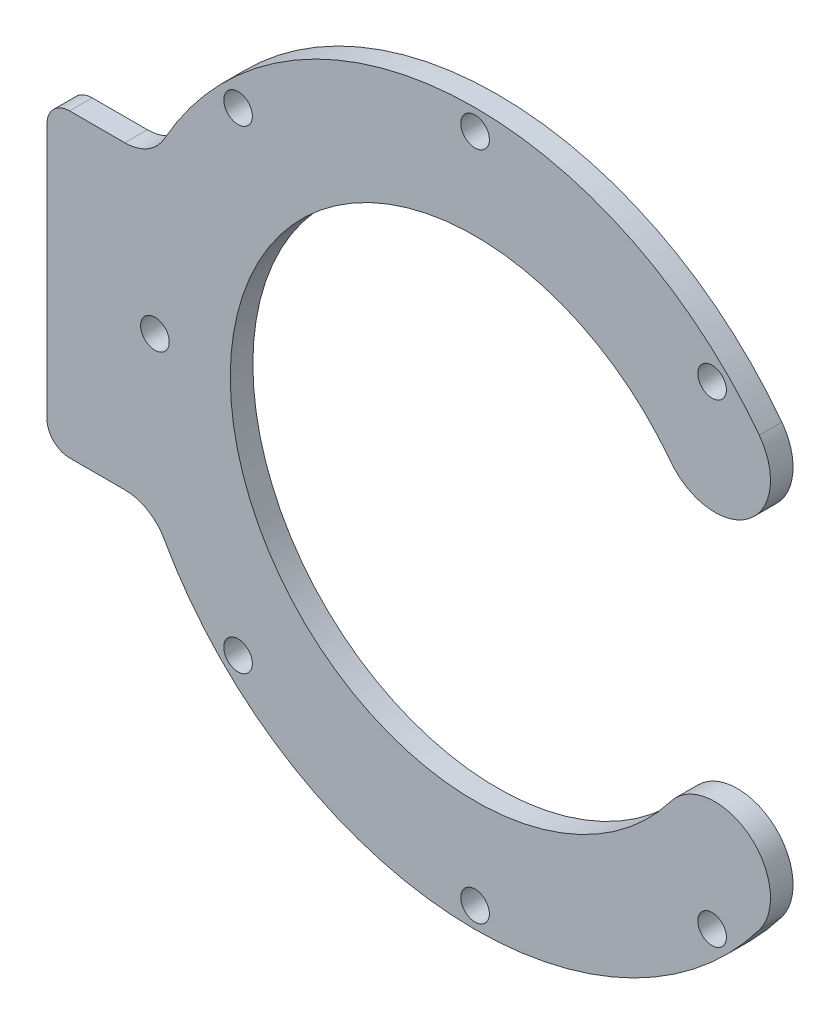
ISO-10303-21;
HEADER;
FILE_DESCRIPTION(('STEP AP214'),'2;1');
FILE_NAME('part.step','',(''),(''),'','','');
FILE_SCHEMA(('AUTOMOTIVE_DESIGN { 1 0 10303 214 1 1 1 1 }'));
ENDSEC;
DATA;
#1=APPLICATION_CONTEXT('core data for automotive mechanical design processes');
#2=APPLICATION_PROTOCOL_DEFINITION('international standard','automotive_design',2000,#1);
#3=PRODUCT_CONTEXT('',#1,'mechanical');
#4=PRODUCT('Part','Part','',(#3));
#5=PRODUCT_RELATED_PRODUCT_CATEGORY('part','',(#4));
#6=PRODUCT_DEFINITION_FORMATION('','',#4);
#7=PRODUCT_DEFINITION_CONTEXT('part definition',#1,'design');
#8=PRODUCT_DEFINITION('design','',#6,#7);
#9=PRODUCT_DEFINITION_SHAPE('','',#8);
#10=(LENGTH_UNIT() NAMED_UNIT(*) SI_UNIT(.MILLI.,.METRE.));
#11=(NAMED_UNIT(*) PLANE_ANGLE_UNIT() SI_UNIT($,.RADIAN.));
#12=(NAMED_UNIT(*) SI_UNIT($,.STERADIAN.) SOLID_ANGLE_UNIT());
#13=UNCERTAINTY_MEASURE_WITH_UNIT(LENGTH_MEASURE(1.E-05),#10,'distance_accuracy_value','');
#14=(GEOMETRIC_REPRESENTATION_CONTEXT(3) GLOBAL_UNCERTAINTY_ASSIGNED_CONTEXT((#13)) GLOBAL_UNIT_ASSIGNED_CONTEXT((#10,
#11,#12)) REPRESENTATION_CONTEXT('',''));
#15=CARTESIAN_POINT('',(0.,0.,0.));
#16=DIRECTION('',(0.,0.,1.));
#17=DIRECTION('',(1.,0.,0.));
#18=AXIS2_PLACEMENT_3D('',#15,#16,#17);
#19=CARTESIAN_POINT('',(0.,0.,3.));
#20=DIRECTION('',(0.,0.,-1.));
#21=DIRECTION('',(-1.,0.,0.));
#22=AXIS2_PLACEMENT_3D('',#19,#20,#21);
#23=CYLINDRICAL_SURFACE('',#22,47.25);
#24=CARTESIAN_POINT('',(0.,0.,0.));
#25=DIRECTION('',(0.,0.,1.));
#26=DIRECTION('',(1.,0.,0.));
#27=AXIS2_PLACEMENT_3D('',#24,#25,#26);
#28=CIRCLE('',#27,47.25);
#29=CARTESIAN_POINT('',(37.7331828676304,28.4388714733542,0.));
#30=VERTEX_POINT('',#29);
#31=CARTESIAN_POINT('',(-41.2597046707554,23.0260563380282,0.));
#32=VERTEX_POINT('',#31);
#33=EDGE_CURVE('E159',#30,#32,#28,.T.);
#34=ORIENTED_EDGE('',*,*,#33,.T.);
#35=DIRECTION('',(0.,0.,-1.));
#36=VECTOR('',#35,1.);
#37=CARTESIAN_POINT('',(-41.2597046707554,23.0260563380282,3.));
#38=LINE('',#37,#36);
#39=CARTESIAN_POINT('',(-41.2597046707554,23.0260563380282,3.));
#40=VERTEX_POINT('',#39);
#41=EDGE_CURVE('E192',#32,#40,#38,.F.);
#42=ORIENTED_EDGE('',*,*,#41,.T.);
#43=CARTESIAN_POINT('',(0.,0.,3.));
#44=DIRECTION('',(0.,0.,1.));
#45=DIRECTION('',(1.,0.,0.));
#46=AXIS2_PLACEMENT_3D('',#43,#44,#45);
#47=CIRCLE('',#46,47.25);
#48=CARTESIAN_POINT('',(37.7331828676304,28.4388714733542,3.));
#49=VERTEX_POINT('',#48);
#50=EDGE_CURVE('E171',#49,#40,#47,.T.);
#51=ORIENTED_EDGE('',*,*,#50,.F.);
#52=DIRECTION('',(0.,0.,1.));
#53=VECTOR('',#52,1.);
#54=CARTESIAN_POINT('',(37.7331828676304,28.4388714733542,0.));
#55=LINE('',#54,#53);
#56=EDGE_CURVE('E310',#30,#49,#55,.T.);
#57=ORIENTED_EDGE('',*,*,#56,.F.);
#58=EDGE_LOOP('',(#34,#42,#51,#57));
#59=FACE_BOUND('',#58,.T.);
#60=ADVANCED_FACE('F40',(#59),#23,.T.);
#61=CARTESIAN_POINT('',(0.,0.,3.));
#62=DIRECTION('',(0.,0.,-1.));
#63=DIRECTION('',(-1.,0.,0.));
#64=AXIS2_PLACEMENT_3D('',#61,#62,#63);
#65=CYLINDRICAL_SURFACE('',#64,32.5);
#66=CARTESIAN_POINT('',(0.,0.,0.));
#67=DIRECTION('',(0.,0.,1.));
#68=DIRECTION('',(1.,0.,0.));
#69=AXIS2_PLACEMENT_3D('',#66,#67,#68);
#70=CIRCLE('',#69,32.5);
#71=CARTESIAN_POINT('',(25.9540411258834,19.5611285266458,0.));
#72=VERTEX_POINT('',#71);
#73=CARTESIAN_POINT('',(25.9540411258834,-19.5611285266458,0.));
#74=VERTEX_POINT('',#73);
#75=EDGE_CURVE('E148',#72,#74,#70,.T.);
#76=ORIENTED_EDGE('',*,*,#75,.F.);
#77=DIRECTION('',(0.,0.,1.));
#78=VECTOR('',#77,1.);
#79=CARTESIAN_POINT('',(25.9540411258834,19.5611285266458,0.));
#80=LINE('',#79,#78);
#81=CARTESIAN_POINT('',(25.9540411258834,19.5611285266458,3.));
#82=VERTEX_POINT('',#81);
#83=EDGE_CURVE('E231',#72,#82,#80,.T.);
#84=ORIENTED_EDGE('',*,*,#83,.T.);
#85=CARTESIAN_POINT('',(0.,0.,3.));
#86=DIRECTION('',(0.,0.,1.));
#87=DIRECTION('',(1.,0.,0.));
#88=AXIS2_PLACEMENT_3D('',#85,#86,#87);
#89=CIRCLE('',#88,32.5);
#90=CARTESIAN_POINT('',(25.9540411258834,-19.5611285266458,3.));
#91=VERTEX_POINT('',#90);
#92=EDGE_CURVE('E150',#82,#91,#89,.T.);
#93=ORIENTED_EDGE('',*,*,#92,.T.);
#94=DIRECTION('',(0.,0.,1.));
#95=VECTOR('',#94,1.);
#96=CARTESIAN_POINT('',(25.9540411258834,-19.5611285266458,0.));
#97=LINE('',#96,#95);
#98=EDGE_CURVE('E133',#74,#91,#97,.T.);
#99=ORIENTED_EDGE('',*,*,#98,.F.);
#100=EDGE_LOOP('',(#76,#84,#93,#99));
#101=FACE_BOUND('',#100,.T.);
#102=ADVANCED_FACE('F146',(#101),#65,.F.);
#103=CARTESIAN_POINT('',(-41.2597046707554,-23.0260563380282,3.));
#104=VERTEX_POINT('',#103);
#105=CARTESIAN_POINT('',(37.7331828676304,-28.4388714733542,3.));
#106=VERTEX_POINT('',#105);
#107=EDGE_CURVE('E218',#104,#106,#47,.T.);
#108=ORIENTED_EDGE('',*,*,#107,.F.);
#109=DIRECTION('',(0.,0.,-1.));
#110=VECTOR('',#109,1.);
#111=CARTESIAN_POINT('',(-41.2597046707554,-23.0260563380282,3.));
#112=LINE('',#111,#110);
#113=CARTESIAN_POINT('',(-41.2597046707554,-23.0260563380282,0.));
#114=VERTEX_POINT('',#113);
#115=EDGE_CURVE('E190',#104,#114,#112,.T.);
#116=ORIENTED_EDGE('',*,*,#115,.T.);
#117=CARTESIAN_POINT('',(37.7331828676304,-28.4388714733542,0.));
#118=VERTEX_POINT('',#117);
#119=EDGE_CURVE('E156',#114,#118,#28,.T.);
#120=ORIENTED_EDGE('',*,*,#119,.T.);
#121=DIRECTION('',(0.,0.,1.));
#122=VECTOR('',#121,1.);
#123=CARTESIAN_POINT('',(37.7331828676304,-28.4388714733542,0.));
#124=LINE('',#123,#122);
#125=EDGE_CURVE('E136',#118,#106,#124,.T.);
#126=ORIENTED_EDGE('',*,*,#125,.T.);
#127=EDGE_LOOP('',(#108,#116,#120,#126));
#128=FACE_BOUND('',#127,.T.);
#129=ADVANCED_FACE('F221',(#128),#23,.T.);
#130=CARTESIAN_POINT('',(0.,0.,3.));
#131=DIRECTION('',(0.,0.,1.));
#132=DIRECTION('',(1.,0.,0.));
#133=AXIS2_PLACEMENT_3D('',#130,#131,#132);
#134=PLANE('',#133);
#135=CARTESIAN_POINT('',(0.,44.5,3.));
#136=DIRECTION('',(0.,0.,1.));
#137=DIRECTION('',(1.,0.,0.));
#138=AXIS2_PLACEMENT_3D('',#135,#136,#137);
#139=CIRCLE('',#138,1.9);
#140=CARTESIAN_POINT('',(1.9,44.5,3.));
#141=VERTEX_POINT('',#140);
#142=EDGE_CURVE('E223',#141,#141,#139,.T.);
#143=ORIENTED_EDGE('',*,*,#142,.F.);
#144=EDGE_LOOP('',(#143));
#145=FACE_BOUND('',#144,.T.);
#146=CARTESIAN_POINT('',(31.4662517628007,31.4662517628031,3.));
#147=DIRECTION('',(0.,0.,1.));
#148=DIRECTION('',(1.,0.,0.));
#149=AXIS2_PLACEMENT_3D('',#146,#147,#148);
#150=CIRCLE('',#149,1.90000000000149);
#151=CARTESIAN_POINT('',(33.3662517628022,31.4662517628031,3.));
#152=VERTEX_POINT('',#151);
#153=EDGE_CURVE('E331',#152,#152,#150,.T.);
#154=ORIENTED_EDGE('',*,*,#153,.F.);
#155=EDGE_LOOP('',(#154));
#156=FACE_BOUND('',#155,.T.);
#157=CARTESIAN_POINT('',(31.4662517628031,-31.4662517627972,3.));
#158=DIRECTION('',(0.,0.,1.));
#159=DIRECTION('',(1.,0.,0.));
#160=AXIS2_PLACEMENT_3D('',#157,#158,#159);
#161=CIRCLE('',#160,1.90000000000466);
#162=CARTESIAN_POINT('',(33.3662517628077,-31.4662517627972,3.));
#163=VERTEX_POINT('',#162);
#164=EDGE_CURVE('E328',#163,#163,#161,.T.);
#165=ORIENTED_EDGE('',*,*,#164,.F.);
#166=EDGE_LOOP('',(#165));
#167=FACE_BOUND('',#166,.T.);
#168=CARTESIAN_POINT('',(3.40586693629788E-12,-44.4999999999966,3.));
#169=DIRECTION('',(0.,0.,1.));
#170=DIRECTION('',(1.,0.,0.));
#171=AXIS2_PLACEMENT_3D('',#168,#169,#170);
#172=CIRCLE('',#171,1.90000000000455);
#173=CARTESIAN_POINT('',(1.90000000000796,-44.4999999999966,3.));
#174=VERTEX_POINT('',#173);
#175=EDGE_CURVE('E325',#174,#174,#172,.T.);
#176=ORIENTED_EDGE('',*,*,#175,.F.);
#177=EDGE_LOOP('',(#176));
#178=FACE_BOUND('',#177,.T.);
#179=CARTESIAN_POINT('',(-31.4662517627973,-31.4662517627997,3.));
#180=DIRECTION('',(0.,0.,1.));
#181=DIRECTION('',(1.,0.,0.));
#182=AXIS2_PLACEMENT_3D('',#179,#180,#181);
#183=CIRCLE('',#182,1.9000000000032);
#184=CARTESIAN_POINT('',(-29.5662517627941,-31.4662517627997,3.));
#185=VERTEX_POINT('',#184);
#186=EDGE_CURVE('E322',#185,#185,#183,.T.);
#187=ORIENTED_EDGE('',*,*,#186,.F.);
#188=EDGE_LOOP('',(#187));
#189=FACE_BOUND('',#188,.T.);
#190=CARTESIAN_POINT('',(-42.4999999999966,0.,3.));
#191=DIRECTION('',(0.,0.,1.));
#192=DIRECTION('',(1.,0.,0.));
#193=AXIS2_PLACEMENT_3D('',#190,#191,#192);
#194=CIRCLE('',#193,1.90000000000142);
#195=CARTESIAN_POINT('',(-40.5999999999952,0.,3.));
#196=VERTEX_POINT('',#195);
#197=EDGE_CURVE('E319',#196,#196,#194,.T.);
#198=ORIENTED_EDGE('',*,*,#197,.F.);
#199=EDGE_LOOP('',(#198));
#200=FACE_BOUND('',#199,.T.);
#201=CARTESIAN_POINT('',(-31.4662517627997,31.4662517628007,3.));
#202=DIRECTION('',(0.,0.,1.));
#203=DIRECTION('',(1.,0.,0.));
#204=AXIS2_PLACEMENT_3D('',#201,#202,#203);
#205=CIRCLE('',#204,1.90000000000034);
#206=CARTESIAN_POINT('',(-29.5662517627993,31.4662517628007,3.));
#207=VERTEX_POINT('',#206);
#208=EDGE_CURVE('E167',#207,#207,#205,.T.);
#209=ORIENTED_EDGE('',*,*,#208,.F.);
#210=EDGE_LOOP('',(#209));
#211=FACE_BOUND('',#210,.T.);
#212=DIRECTION('',(0.,-1.,0.));
#213=VECTOR('',#212,1.);
#214=CARTESIAN_POINT('',(-56.8317639141794,0.,3.));
#215=LINE('',#214,#213);
#216=CARTESIAN_POINT('',(-56.8317639141794,16.95,3.));
#217=VERTEX_POINT('',#216);
#218=CARTESIAN_POINT('',(-56.8317639141794,-16.95,3.));
#219=VERTEX_POINT('',#218);
#220=EDGE_CURVE('E608',#217,#219,#215,.T.);
#221=ORIENTED_EDGE('',*,*,#220,.T.);
#222=CARTESIAN_POINT('',(-53.8317639141794,-16.95,3.));
#223=DIRECTION('',(0.,0.,1.));
#224=DIRECTION('',(1.,0.,0.));
#225=AXIS2_PLACEMENT_3D('',#222,#223,#224);
#226=CIRCLE('',#225,3.);
#227=CARTESIAN_POINT('',(-53.8317639141794,-19.95,3.));
#228=VERTEX_POINT('',#227);
#229=EDGE_CURVE('E176',#219,#228,#226,.T.);
#230=ORIENTED_EDGE('',*,*,#229,.T.);
#231=DIRECTION('',(1.,0.,0.));
#232=VECTOR('',#231,1.);
#233=CARTESIAN_POINT('',(0.,-19.95,3.));
#234=LINE('',#233,#232);
#235=CARTESIAN_POINT('',(-46.4990322479942,-19.95,3.));
#236=VERTEX_POINT('',#235);
#237=EDGE_CURVE('E219',#228,#236,#234,.T.);
#238=ORIENTED_EDGE('',*,*,#237,.T.);
#239=CARTESIAN_POINT('',(-46.4990322479942,-25.95,3.));
#240=DIRECTION('',(0.,0.,1.));
#241=DIRECTION('',(1.,0.,0.));
#242=AXIS2_PLACEMENT_3D('',#239,#240,#241);
#243=CIRCLE('',#242,6.);
#244=EDGE_CURVE('E196',#236,#104,#243,.F.);
#245=ORIENTED_EDGE('',*,*,#244,.T.);
#246=ORIENTED_EDGE('',*,*,#107,.T.);
#247=CARTESIAN_POINT('',(31.8436119967569,-24.,3.));
#248=DIRECTION('',(0.,0.,1.));
#249=DIRECTION('',(1.,0.,0.));
#250=AXIS2_PLACEMENT_3D('',#247,#248,#249);
#251=CIRCLE('',#250,7.375);
#252=EDGE_CURVE('E603',#106,#91,#251,.T.);
#253=ORIENTED_EDGE('',*,*,#252,.T.);
#254=ORIENTED_EDGE('',*,*,#92,.F.);
#255=CARTESIAN_POINT('',(31.8436119967569,24.,3.));
#256=DIRECTION('',(0.,0.,1.));
#257=DIRECTION('',(1.,0.,0.));
#258=AXIS2_PLACEMENT_3D('',#255,#256,#257);
#259=CIRCLE('',#258,7.375);
#260=EDGE_CURVE('E141',#82,#49,#259,.T.);
#261=ORIENTED_EDGE('',*,*,#260,.T.);
#262=ORIENTED_EDGE('',*,*,#50,.T.);
#263=CARTESIAN_POINT('',(-46.4990322479942,25.95,3.));
#264=DIRECTION('',(0.,0.,1.));
#265=DIRECTION('',(1.,0.,0.));
#266=AXIS2_PLACEMENT_3D('',#263,#264,#265);
#267=CIRCLE('',#266,6.);
#268=CARTESIAN_POINT('',(-46.4990322479942,19.95,3.));
#269=VERTEX_POINT('',#268);
#270=EDGE_CURVE('E48',#40,#269,#267,.F.);
#271=ORIENTED_EDGE('',*,*,#270,.T.);
#272=DIRECTION('',(1.,0.,0.));
#273=VECTOR('',#272,1.);
#274=CARTESIAN_POINT('',(0.,19.95,3.));
#275=LINE('',#274,#273);
#276=CARTESIAN_POINT('',(-53.8317639141794,19.95,3.));
#277=VERTEX_POINT('',#276);
#278=EDGE_CURVE('E302',#277,#269,#275,.T.);
#279=ORIENTED_EDGE('',*,*,#278,.F.);
#280=CARTESIAN_POINT('',(-53.8317639141794,16.95,3.));
#281=DIRECTION('',(0.,0.,1.));
#282=DIRECTION('',(1.,0.,0.));
#283=AXIS2_PLACEMENT_3D('',#280,#281,#282);
#284=CIRCLE('',#283,3.);
#285=EDGE_CURVE('E174',#277,#217,#284,.T.);
#286=ORIENTED_EDGE('',*,*,#285,.T.);
#287=EDGE_LOOP('',(#221,#230,#238,#245,#246,#253,#254,#261,#262,#271,#279,#286));
#288=FACE_BOUND('',#287,.T.);
#289=ADVANCED_FACE('F217',(#145,#156,#167,#178,#189,#200,#211,#288),#134,.T.);
#290=CARTESIAN_POINT('',(0.,0.,0.));
#291=DIRECTION('',(0.,0.,1.));
#292=DIRECTION('',(1.,0.,0.));
#293=AXIS2_PLACEMENT_3D('',#290,#291,#292);
#294=PLANE('',#293);
#295=CARTESIAN_POINT('',(0.,44.5,0.));
#296=DIRECTION('',(0.,0.,1.));
#297=DIRECTION('',(1.,0.,0.));
#298=AXIS2_PLACEMENT_3D('',#295,#296,#297);
#299=CIRCLE('',#298,1.9);
#300=CARTESIAN_POINT('',(1.9,44.5,0.));
#301=VERTEX_POINT('',#300);
#302=EDGE_CURVE('E157',#301,#301,#299,.T.);
#303=ORIENTED_EDGE('',*,*,#302,.T.);
#304=EDGE_LOOP('',(#303));
#305=FACE_BOUND('',#304,.T.);
#306=CARTESIAN_POINT('',(31.4662517628007,31.4662517628031,0.));
#307=DIRECTION('',(0.,0.,1.));
#308=DIRECTION('',(1.,0.,0.));
#309=AXIS2_PLACEMENT_3D('',#306,#307,#308);
#310=CIRCLE('',#309,1.90000000000149);
#311=CARTESIAN_POINT('',(33.3662517628022,31.4662517628031,0.));
#312=VERTEX_POINT('',#311);
#313=EDGE_CURVE('E162',#312,#312,#310,.T.);
#314=ORIENTED_EDGE('',*,*,#313,.T.);
#315=EDGE_LOOP('',(#314));
#316=FACE_BOUND('',#315,.T.);
#317=CARTESIAN_POINT('',(31.4662517628031,-31.4662517627972,0.));
#318=DIRECTION('',(0.,0.,1.));
#319=DIRECTION('',(1.,0.,0.));
#320=AXIS2_PLACEMENT_3D('',#317,#318,#319);
#321=CIRCLE('',#320,1.90000000000466);
#322=CARTESIAN_POINT('',(33.3662517628077,-31.4662517627972,0.));
#323=VERTEX_POINT('',#322);
#324=EDGE_CURVE('E240',#323,#323,#321,.T.);
#325=ORIENTED_EDGE('',*,*,#324,.T.);
#326=EDGE_LOOP('',(#325));
#327=FACE_BOUND('',#326,.T.);
#328=CARTESIAN_POINT('',(3.40586693629788E-12,-44.4999999999966,0.));
#329=DIRECTION('',(0.,0.,1.));
#330=DIRECTION('',(1.,0.,0.));
#331=AXIS2_PLACEMENT_3D('',#328,#329,#330);
#332=CIRCLE('',#331,1.90000000000455);
#333=CARTESIAN_POINT('',(1.90000000000796,-44.4999999999966,0.));
#334=VERTEX_POINT('',#333);
#335=EDGE_CURVE('E237',#334,#334,#332,.T.);
#336=ORIENTED_EDGE('',*,*,#335,.T.);
#337=EDGE_LOOP('',(#336));
#338=FACE_BOUND('',#337,.T.);
#339=CARTESIAN_POINT('',(-31.4662517627973,-31.4662517627997,0.));
#340=DIRECTION('',(0.,0.,1.));
#341=DIRECTION('',(1.,0.,0.));
#342=AXIS2_PLACEMENT_3D('',#339,#340,#341);
#343=CIRCLE('',#342,1.9000000000032);
#344=CARTESIAN_POINT('',(-29.5662517627941,-31.4662517627997,0.));
#345=VERTEX_POINT('',#344);
#346=EDGE_CURVE('E234',#345,#345,#343,.T.);
#347=ORIENTED_EDGE('',*,*,#346,.T.);
#348=EDGE_LOOP('',(#347));
#349=FACE_BOUND('',#348,.T.);
#350=CARTESIAN_POINT('',(-42.4999999999966,0.,0.));
#351=DIRECTION('',(0.,0.,1.));
#352=DIRECTION('',(1.,0.,0.));
#353=AXIS2_PLACEMENT_3D('',#350,#351,#352);
#354=CIRCLE('',#353,1.90000000000142);
#355=CARTESIAN_POINT('',(-40.5999999999952,0.,0.));
#356=VERTEX_POINT('',#355);
#357=EDGE_CURVE('E230',#356,#356,#354,.T.);
#358=ORIENTED_EDGE('',*,*,#357,.T.);
#359=EDGE_LOOP('',(#358));
#360=FACE_BOUND('',#359,.T.);
#361=CARTESIAN_POINT('',(-31.4662517627997,31.4662517628007,0.));
#362=DIRECTION('',(0.,0.,1.));
#363=DIRECTION('',(1.,0.,0.));
#364=AXIS2_PLACEMENT_3D('',#361,#362,#363);
#365=CIRCLE('',#364,1.90000000000034);
#366=CARTESIAN_POINT('',(-29.5662517627993,31.4662517628007,0.));
#367=VERTEX_POINT('',#366);
#368=EDGE_CURVE('E227',#367,#367,#365,.T.);
#369=ORIENTED_EDGE('',*,*,#368,.T.);
#370=EDGE_LOOP('',(#369));
#371=FACE_BOUND('',#370,.T.);
#372=DIRECTION('',(1.,0.,0.));
#373=VECTOR('',#372,1.);
#374=CARTESIAN_POINT('',(0.,-19.95,0.));
#375=LINE('',#374,#373);
#376=CARTESIAN_POINT('',(-53.8317639141794,-19.95,0.));
#377=VERTEX_POINT('',#376);
#378=CARTESIAN_POINT('',(-46.4990322479942,-19.95,0.));
#379=VERTEX_POINT('',#378);
#380=EDGE_CURVE('E201',#377,#379,#375,.T.);
#381=ORIENTED_EDGE('',*,*,#380,.F.);
#382=CARTESIAN_POINT('',(-53.8317639141794,-16.95,0.));
#383=DIRECTION('',(0.,0.,1.));
#384=DIRECTION('',(1.,0.,0.));
#385=AXIS2_PLACEMENT_3D('',#382,#383,#384);
#386=CIRCLE('',#385,3.);
#387=CARTESIAN_POINT('',(-56.8317639141794,-16.95,0.));
#388=VERTEX_POINT('',#387);
#389=EDGE_CURVE('E182',#377,#388,#386,.F.);
#390=ORIENTED_EDGE('',*,*,#389,.T.);
#391=DIRECTION('',(0.,-1.,0.));
#392=VECTOR('',#391,1.);
#393=CARTESIAN_POINT('',(-56.8317639141794,0.,0.));
#394=LINE('',#393,#392);
#395=CARTESIAN_POINT('',(-56.8317639141794,16.95,0.));
#396=VERTEX_POINT('',#395);
#397=EDGE_CURVE('E212',#396,#388,#394,.T.);
#398=ORIENTED_EDGE('',*,*,#397,.F.);
#399=CARTESIAN_POINT('',(-53.8317639141794,16.95,0.));
#400=DIRECTION('',(0.,0.,1.));
#401=DIRECTION('',(1.,0.,0.));
#402=AXIS2_PLACEMENT_3D('',#399,#400,#401);
#403=CIRCLE('',#402,3.);
#404=CARTESIAN_POINT('',(-53.8317639141794,19.95,0.));
#405=VERTEX_POINT('',#404);
#406=EDGE_CURVE('E180',#396,#405,#403,.F.);
#407=ORIENTED_EDGE('',*,*,#406,.T.);
#408=DIRECTION('',(1.,0.,0.));
#409=VECTOR('',#408,1.);
#410=CARTESIAN_POINT('',(0.,19.95,0.));
#411=LINE('',#410,#409);
#412=CARTESIAN_POINT('',(-46.4990322479942,19.95,0.));
#413=VERTEX_POINT('',#412);
#414=EDGE_CURVE('E211',#405,#413,#411,.T.);
#415=ORIENTED_EDGE('',*,*,#414,.T.);
#416=CARTESIAN_POINT('',(-46.4990322479942,25.95,0.));
#417=DIRECTION('',(0.,0.,1.));
#418=DIRECTION('',(1.,0.,0.));
#419=AXIS2_PLACEMENT_3D('',#416,#417,#418);
#420=CIRCLE('',#419,6.);
#421=EDGE_CURVE('E11',#413,#32,#420,.T.);
#422=ORIENTED_EDGE('',*,*,#421,.T.);
#423=ORIENTED_EDGE('',*,*,#33,.F.);
#424=CARTESIAN_POINT('',(31.8436119967569,24.,0.));
#425=DIRECTION('',(0.,0.,1.));
#426=DIRECTION('',(1.,0.,0.));
#427=AXIS2_PLACEMENT_3D('',#424,#425,#426);
#428=CIRCLE('',#427,7.375);
#429=EDGE_CURVE('E140',#72,#30,#428,.T.);
#430=ORIENTED_EDGE('',*,*,#429,.F.);
#431=ORIENTED_EDGE('',*,*,#75,.T.);
#432=CARTESIAN_POINT('',(31.8436119967569,-24.,0.));
#433=DIRECTION('',(0.,0.,1.));
#434=DIRECTION('',(1.,0.,0.));
#435=AXIS2_PLACEMENT_3D('',#432,#433,#434);
#436=CIRCLE('',#435,7.375);
#437=EDGE_CURVE('E129',#118,#74,#436,.T.);
#438=ORIENTED_EDGE('',*,*,#437,.F.);
#439=ORIENTED_EDGE('',*,*,#119,.F.);
#440=CARTESIAN_POINT('',(-46.4990322479942,-25.95,0.));
#441=DIRECTION('',(0.,0.,1.));
#442=DIRECTION('',(1.,0.,0.));
#443=AXIS2_PLACEMENT_3D('',#440,#441,#442);
#444=CIRCLE('',#443,6.);
#445=EDGE_CURVE('E198',#114,#379,#444,.T.);
#446=ORIENTED_EDGE('',*,*,#445,.T.);
#447=EDGE_LOOP('',(#381,#390,#398,#407,#415,#422,#423,#430,#431,#438,#439,#446));
#448=FACE_BOUND('',#447,.T.);
#449=ADVANCED_FACE('F154',(#305,#316,#327,#338,#349,#360,#371,#448),#294,.F.);
#450=CARTESIAN_POINT('',(0.,44.5,3.));
#451=DIRECTION('',(0.,0.,-1.));
#452=DIRECTION('',(-1.,0.,0.));
#453=AXIS2_PLACEMENT_3D('',#450,#451,#452);
#454=CYLINDRICAL_SURFACE('',#453,1.9);
#455=ORIENTED_EDGE('',*,*,#142,.T.);
#456=EDGE_LOOP('',(#455));
#457=FACE_BOUND('',#456,.T.);
#458=ORIENTED_EDGE('',*,*,#302,.F.);
#459=EDGE_LOOP('',(#458));
#460=FACE_BOUND('',#459,.T.);
#461=ADVANCED_FACE('F250',(#457,#460),#454,.F.);
#462=CARTESIAN_POINT('',(31.4662517628007,31.4662517628031,3.));
#463=DIRECTION('',(0.,0.,-1.));
#464=DIRECTION('',(-1.,0.,0.));
#465=AXIS2_PLACEMENT_3D('',#462,#463,#464);
#466=CYLINDRICAL_SURFACE('',#465,1.90000000000149);
#467=ORIENTED_EDGE('',*,*,#153,.T.);
#468=EDGE_LOOP('',(#467));
#469=FACE_BOUND('',#468,.T.);
#470=ORIENTED_EDGE('',*,*,#313,.F.);
#471=EDGE_LOOP('',(#470));
#472=FACE_BOUND('',#471,.T.);
#473=ADVANCED_FACE('F247',(#469,#472),#466,.F.);
#474=CARTESIAN_POINT('',(31.4662517628031,-31.4662517627972,3.));
#475=DIRECTION('',(0.,0.,-1.));
#476=DIRECTION('',(-1.,0.,0.));
#477=AXIS2_PLACEMENT_3D('',#474,#475,#476);
#478=CYLINDRICAL_SURFACE('',#477,1.90000000000466);
#479=ORIENTED_EDGE('',*,*,#164,.T.);
#480=EDGE_LOOP('',(#479));
#481=FACE_BOUND('',#480,.T.);
#482=ORIENTED_EDGE('',*,*,#324,.F.);
#483=EDGE_LOOP('',(#482));
#484=FACE_BOUND('',#483,.T.);
#485=ADVANCED_FACE('F249',(#481,#484),#478,.F.);
#486=CARTESIAN_POINT('',(3.40586693629788E-12,-44.4999999999966,3.));
#487=DIRECTION('',(0.,0.,-1.));
#488=DIRECTION('',(-1.,0.,0.));
#489=AXIS2_PLACEMENT_3D('',#486,#487,#488);
#490=CYLINDRICAL_SURFACE('',#489,1.90000000000455);
#491=ORIENTED_EDGE('',*,*,#175,.T.);
#492=EDGE_LOOP('',(#491));
#493=FACE_BOUND('',#492,.T.);
#494=ORIENTED_EDGE('',*,*,#335,.F.);
#495=EDGE_LOOP('',(#494));
#496=FACE_BOUND('',#495,.T.);
#497=ADVANCED_FACE('F257',(#493,#496),#490,.F.);
#498=CARTESIAN_POINT('',(-31.4662517627973,-31.4662517627997,3.));
#499=DIRECTION('',(0.,0.,-1.));
#500=DIRECTION('',(-1.,0.,0.));
#501=AXIS2_PLACEMENT_3D('',#498,#499,#500);
#502=CYLINDRICAL_SURFACE('',#501,1.9000000000032);
#503=ORIENTED_EDGE('',*,*,#186,.T.);
#504=EDGE_LOOP('',(#503));
#505=FACE_BOUND('',#504,.T.);
#506=ORIENTED_EDGE('',*,*,#346,.F.);
#507=EDGE_LOOP('',(#506));
#508=FACE_BOUND('',#507,.T.);
#509=ADVANCED_FACE('F356',(#505,#508),#502,.F.);
#510=CARTESIAN_POINT('',(-42.4999999999966,0.,3.));
#511=DIRECTION('',(0.,0.,-1.));
#512=DIRECTION('',(-1.,0.,0.));
#513=AXIS2_PLACEMENT_3D('',#510,#511,#512);
#514=CYLINDRICAL_SURFACE('',#513,1.90000000000142);
#515=ORIENTED_EDGE('',*,*,#197,.T.);
#516=EDGE_LOOP('',(#515));
#517=FACE_BOUND('',#516,.T.);
#518=ORIENTED_EDGE('',*,*,#357,.F.);
#519=EDGE_LOOP('',(#518));
#520=FACE_BOUND('',#519,.T.);
#521=ADVANCED_FACE('F349',(#517,#520),#514,.F.);
#522=CARTESIAN_POINT('',(-31.4662517627997,31.4662517628007,3.));
#523=DIRECTION('',(0.,0.,-1.));
#524=DIRECTION('',(-1.,0.,0.));
#525=AXIS2_PLACEMENT_3D('',#522,#523,#524);
#526=CYLINDRICAL_SURFACE('',#525,1.90000000000034);
#527=ORIENTED_EDGE('',*,*,#208,.T.);
#528=EDGE_LOOP('',(#527));
#529=FACE_BOUND('',#528,.T.);
#530=ORIENTED_EDGE('',*,*,#368,.F.);
#531=EDGE_LOOP('',(#530));
#532=FACE_BOUND('',#531,.T.);
#533=ADVANCED_FACE('F287',(#529,#532),#526,.F.);
#534=CARTESIAN_POINT('',(31.8436119967569,-24.,0.));
#535=DIRECTION('',(0.,0.,1.));
#536=DIRECTION('',(1.,0.,0.));
#537=AXIS2_PLACEMENT_3D('',#534,#535,#536);
#538=CYLINDRICAL_SURFACE('',#537,7.375);
#539=ORIENTED_EDGE('',*,*,#252,.F.);
#540=ORIENTED_EDGE('',*,*,#125,.F.);
#541=ORIENTED_EDGE('',*,*,#437,.T.);
#542=ORIENTED_EDGE('',*,*,#98,.T.);
#543=EDGE_LOOP('',(#539,#540,#541,#542));
#544=FACE_BOUND('',#543,.T.);
#545=ADVANCED_FACE('F132',(#544),#538,.T.);
#546=CARTESIAN_POINT('',(31.8436119967569,24.,0.));
#547=DIRECTION('',(0.,0.,1.));
#548=DIRECTION('',(1.,0.,0.));
#549=AXIS2_PLACEMENT_3D('',#546,#547,#548);
#550=CYLINDRICAL_SURFACE('',#549,7.375);
#551=ORIENTED_EDGE('',*,*,#260,.F.);
#552=ORIENTED_EDGE('',*,*,#83,.F.);
#553=ORIENTED_EDGE('',*,*,#429,.T.);
#554=ORIENTED_EDGE('',*,*,#56,.T.);
#555=EDGE_LOOP('',(#551,#552,#553,#554));
#556=FACE_BOUND('',#555,.T.);
#557=ADVANCED_FACE('F286',(#556),#550,.T.);
#558=CARTESIAN_POINT('',(-56.8317639141794,0.,0.));
#559=DIRECTION('',(-1.,0.,0.));
#560=DIRECTION('',(0.,0.,1.));
#561=AXIS2_PLACEMENT_3D('',#558,#559,#560);
#562=PLANE('',#561);
#563=ORIENTED_EDGE('',*,*,#397,.T.);
#564=DIRECTION('',(0.,0.,1.));
#565=VECTOR('',#564,1.);
#566=CARTESIAN_POINT('',(-56.8317639141794,-16.95,0.));
#567=LINE('',#566,#565);
#568=EDGE_CURVE('E170',#388,#219,#567,.T.);
#569=ORIENTED_EDGE('',*,*,#568,.T.);
#570=ORIENTED_EDGE('',*,*,#220,.F.);
#571=DIRECTION('',(0.,0.,1.));
#572=VECTOR('',#571,1.);
#573=CARTESIAN_POINT('',(-56.8317639141794,16.95,0.));
#574=LINE('',#573,#572);
#575=EDGE_CURVE('E168',#217,#396,#574,.F.);
#576=ORIENTED_EDGE('',*,*,#575,.T.);
#577=EDGE_LOOP('',(#563,#569,#570,#576));
#578=FACE_BOUND('',#577,.T.);
#579=ADVANCED_FACE('F290',(#578),#562,.T.);
#580=CARTESIAN_POINT('',(0.,19.95,0.));
#581=DIRECTION('',(0.,-1.,0.));
#582=DIRECTION('',(0.,0.,-1.));
#583=AXIS2_PLACEMENT_3D('',#580,#581,#582);
#584=PLANE('',#583);
#585=ORIENTED_EDGE('',*,*,#278,.T.);
#586=DIRECTION('',(0.,0.,1.));
#587=VECTOR('',#586,1.);
#588=CARTESIAN_POINT('',(-46.4990322479942,19.95,0.));
#589=LINE('',#588,#587);
#590=EDGE_CURVE('E61',#269,#413,#589,.F.);
#591=ORIENTED_EDGE('',*,*,#590,.T.);
#592=ORIENTED_EDGE('',*,*,#414,.F.);
#593=DIRECTION('',(0.,0.,1.));
#594=VECTOR('',#593,1.);
#595=CARTESIAN_POINT('',(-53.8317639141794,19.95,3.));
#596=LINE('',#595,#594);
#597=EDGE_CURVE('E184',#405,#277,#596,.T.);
#598=ORIENTED_EDGE('',*,*,#597,.T.);
#599=EDGE_LOOP('',(#585,#591,#592,#598));
#600=FACE_BOUND('',#599,.T.);
#601=ADVANCED_FACE('F294',(#600),#584,.F.);
#602=CARTESIAN_POINT('',(0.,-19.95,0.));
#603=DIRECTION('',(0.,-1.,0.));
#604=DIRECTION('',(0.,0.,-1.));
#605=AXIS2_PLACEMENT_3D('',#602,#603,#604);
#606=PLANE('',#605);
#607=ORIENTED_EDGE('',*,*,#380,.T.);
#608=DIRECTION('',(0.,0.,-1.));
#609=VECTOR('',#608,1.);
#610=CARTESIAN_POINT('',(-46.4990322479942,-19.95,0.));
#611=LINE('',#610,#609);
#612=EDGE_CURVE('E187',#379,#236,#611,.F.);
#613=ORIENTED_EDGE('',*,*,#612,.T.);
#614=ORIENTED_EDGE('',*,*,#237,.F.);
#615=DIRECTION('',(0.,0.,1.));
#616=VECTOR('',#615,1.);
#617=CARTESIAN_POINT('',(-53.8317639141794,-19.95,0.));
#618=LINE('',#617,#616);
#619=EDGE_CURVE('E178',#228,#377,#618,.F.);
#620=ORIENTED_EDGE('',*,*,#619,.T.);
#621=EDGE_LOOP('',(#607,#613,#614,#620));
#622=FACE_BOUND('',#621,.T.);
#623=ADVANCED_FACE('F207',(#622),#606,.T.);
#624=CARTESIAN_POINT('',(-53.8317639141794,-16.95,0.));
#625=DIRECTION('',(0.,0.,1.));
#626=DIRECTION('',(1.,0.,0.));
#627=AXIS2_PLACEMENT_3D('',#624,#625,#626);
#628=CYLINDRICAL_SURFACE('',#627,3.);
#629=ORIENTED_EDGE('',*,*,#389,.F.);
#630=ORIENTED_EDGE('',*,*,#619,.F.);
#631=ORIENTED_EDGE('',*,*,#229,.F.);
#632=ORIENTED_EDGE('',*,*,#568,.F.);
#633=EDGE_LOOP('',(#629,#630,#631,#632));
#634=FACE_BOUND('',#633,.T.);
#635=ADVANCED_FACE('F298',(#634),#628,.T.);
#636=CARTESIAN_POINT('',(-53.8317639141794,16.95,0.));
#637=DIRECTION('',(0.,0.,-1.));
#638=DIRECTION('',(-1.,0.,0.));
#639=AXIS2_PLACEMENT_3D('',#636,#637,#638);
#640=CYLINDRICAL_SURFACE('',#639,3.);
#641=ORIENTED_EDGE('',*,*,#406,.F.);
#642=ORIENTED_EDGE('',*,*,#575,.F.);
#643=ORIENTED_EDGE('',*,*,#285,.F.);
#644=ORIENTED_EDGE('',*,*,#597,.F.);
#645=EDGE_LOOP('',(#641,#642,#643,#644));
#646=FACE_BOUND('',#645,.T.);
#647=ADVANCED_FACE('F363',(#646),#640,.T.);
#648=CARTESIAN_POINT('',(-46.4990322479942,-25.95,3.));
#649=DIRECTION('',(0.,0.,-1.));
#650=DIRECTION('',(-1.,0.,0.));
#651=AXIS2_PLACEMENT_3D('',#648,#649,#650);
#652=CYLINDRICAL_SURFACE('',#651,6.);
#653=ORIENTED_EDGE('',*,*,#445,.F.);
#654=ORIENTED_EDGE('',*,*,#115,.F.);
#655=ORIENTED_EDGE('',*,*,#244,.F.);
#656=ORIENTED_EDGE('',*,*,#612,.F.);
#657=EDGE_LOOP('',(#653,#654,#655,#656));
#658=FACE_BOUND('',#657,.T.);
#659=ADVANCED_FACE('F214',(#658),#652,.F.);
#660=CARTESIAN_POINT('',(-46.4990322479942,25.95,3.));
#661=DIRECTION('',(0.,0.,-1.));
#662=DIRECTION('',(-1.,0.,0.));
#663=AXIS2_PLACEMENT_3D('',#660,#661,#662);
#664=CYLINDRICAL_SURFACE('',#663,6.);
#665=ORIENTED_EDGE('',*,*,#421,.F.);
#666=ORIENTED_EDGE('',*,*,#590,.F.);
#667=ORIENTED_EDGE('',*,*,#270,.F.);
#668=ORIENTED_EDGE('',*,*,#41,.F.);
#669=EDGE_LOOP('',(#665,#666,#667,#668));
#670=FACE_BOUND('',#669,.T.);
#671=ADVANCED_FACE('F42',(#670),#664,.F.);
#672=CLOSED_SHELL('',(#60,#102,#129,#289,#449,#461,#473,#485,#497,#509,#521,#533,#545,#557,#579,
#601,#623,#635,#647,#659,#671));
#673=MANIFOLD_SOLID_BREP('B2',#672);
#674=ADVANCED_BREP_SHAPE_REPRESENTATION('',(#18,#673),#14);
#675=SHAPE_DEFINITION_REPRESENTATION(#9,#674);
ENDSEC;
END-ISO-10303-21;
